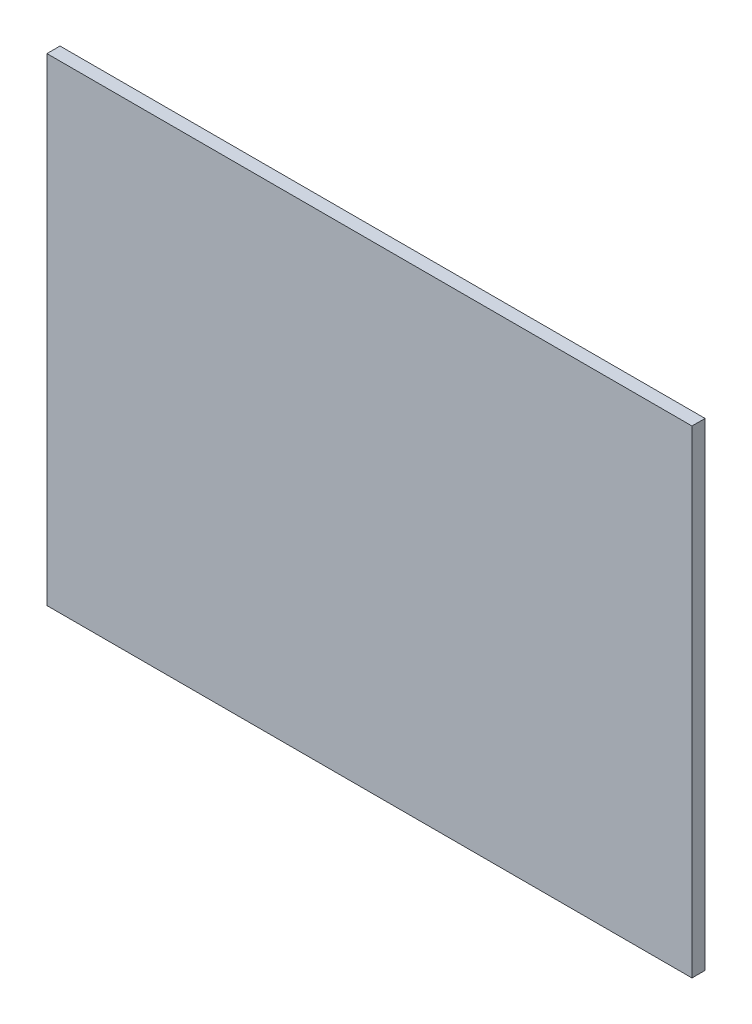
ISO-10303-21;
HEADER;
FILE_DESCRIPTION(('STEP AP214'),'2;1');
FILE_NAME('part.step','',(''),(''),'','','');
FILE_SCHEMA(('AUTOMOTIVE_DESIGN { 1 0 10303 214 1 1 1 1 }'));
ENDSEC;
DATA;
#1=APPLICATION_CONTEXT('core data for automotive mechanical design processes');
#2=APPLICATION_PROTOCOL_DEFINITION('international standard','automotive_design',2000,#1);
#3=PRODUCT_CONTEXT('',#1,'mechanical');
#4=PRODUCT('Part','Part','',(#3));
#5=PRODUCT_RELATED_PRODUCT_CATEGORY('part','',(#4));
#6=PRODUCT_DEFINITION_FORMATION('','',#4);
#7=PRODUCT_DEFINITION_CONTEXT('part definition',#1,'design');
#8=PRODUCT_DEFINITION('design','',#6,#7);
#9=PRODUCT_DEFINITION_SHAPE('','',#8);
#10=(LENGTH_UNIT() NAMED_UNIT(*) SI_UNIT(.MILLI.,.METRE.));
#11=(NAMED_UNIT(*) PLANE_ANGLE_UNIT() SI_UNIT($,.RADIAN.));
#12=(NAMED_UNIT(*) SI_UNIT($,.STERADIAN.) SOLID_ANGLE_UNIT());
#13=UNCERTAINTY_MEASURE_WITH_UNIT(LENGTH_MEASURE(1.E-05),#10,'distance_accuracy_value','');
#14=(GEOMETRIC_REPRESENTATION_CONTEXT(3) GLOBAL_UNCERTAINTY_ASSIGNED_CONTEXT((#13)) GLOBAL_UNIT_ASSIGNED_CONTEXT((#10,
#11,#12)) REPRESENTATION_CONTEXT('',''));
#15=CARTESIAN_POINT('',(0.,0.,0.));
#16=DIRECTION('',(0.,0.,1.));
#17=DIRECTION('',(1.,0.,0.));
#18=AXIS2_PLACEMENT_3D('',#15,#16,#17);
#19=CARTESIAN_POINT('',(49.25,36.5,2.));
#20=DIRECTION('',(-1.,0.,0.));
#21=DIRECTION('',(0.,-1.,0.));
#22=AXIS2_PLACEMENT_3D('',#19,#20,#21);
#23=PLANE('',#22);
#24=DIRECTION('',(0.,1.,0.));
#25=VECTOR('',#24,1.);
#26=CARTESIAN_POINT('',(49.25,36.5,0.));
#27=LINE('',#26,#25);
#28=CARTESIAN_POINT('',(49.25,-36.5,0.));
#29=VERTEX_POINT('',#28);
#30=CARTESIAN_POINT('',(49.25,36.5,0.));
#31=VERTEX_POINT('',#30);
#32=EDGE_CURVE('E96',#29,#31,#27,.T.);
#33=ORIENTED_EDGE('',*,*,#32,.T.);
#34=DIRECTION('',(0.,0.,-1.));
#35=VECTOR('',#34,1.);
#36=CARTESIAN_POINT('',(49.25,36.5,2.));
#37=LINE('',#36,#35);
#38=CARTESIAN_POINT('',(49.25,36.5,2.));
#39=VERTEX_POINT('',#38);
#40=EDGE_CURVE('E11',#39,#31,#37,.T.);
#41=ORIENTED_EDGE('',*,*,#40,.F.);
#42=DIRECTION('',(0.,1.,0.));
#43=VECTOR('',#42,1.);
#44=CARTESIAN_POINT('',(49.25,36.5,2.));
#45=LINE('',#44,#43);
#46=CARTESIAN_POINT('',(49.25,-36.5,2.));
#47=VERTEX_POINT('',#46);
#48=EDGE_CURVE('E84',#47,#39,#45,.T.);
#49=ORIENTED_EDGE('',*,*,#48,.F.);
#50=DIRECTION('',(0.,0.,-1.));
#51=VECTOR('',#50,1.);
#52=CARTESIAN_POINT('',(49.25,-36.5,2.));
#53=LINE('',#52,#51);
#54=EDGE_CURVE('E92',#47,#29,#53,.T.);
#55=ORIENTED_EDGE('',*,*,#54,.T.);
#56=EDGE_LOOP('',(#33,#41,#49,#55));
#57=FACE_BOUND('',#56,.T.);
#58=ADVANCED_FACE('F33',(#57),#23,.F.);
#59=CARTESIAN_POINT('',(-49.25,36.5,2.));
#60=DIRECTION('',(0.,-1.,0.));
#61=DIRECTION('',(0.,0.,-1.));
#62=AXIS2_PLACEMENT_3D('',#59,#60,#61);
#63=PLANE('',#62);
#64=DIRECTION('',(-1.,0.,0.));
#65=VECTOR('',#64,1.);
#66=CARTESIAN_POINT('',(-49.25,36.5,0.));
#67=LINE('',#66,#65);
#68=CARTESIAN_POINT('',(-49.25,36.5,0.));
#69=VERTEX_POINT('',#68);
#70=EDGE_CURVE('E88',#31,#69,#67,.T.);
#71=ORIENTED_EDGE('',*,*,#70,.T.);
#72=DIRECTION('',(0.,0.,-1.));
#73=VECTOR('',#72,1.);
#74=CARTESIAN_POINT('',(-49.25,36.5,2.));
#75=LINE('',#74,#73);
#76=CARTESIAN_POINT('',(-49.25,36.5,2.));
#77=VERTEX_POINT('',#76);
#78=EDGE_CURVE('E41',#77,#69,#75,.T.);
#79=ORIENTED_EDGE('',*,*,#78,.F.);
#80=DIRECTION('',(-1.,0.,0.));
#81=VECTOR('',#80,1.);
#82=CARTESIAN_POINT('',(-49.25,36.5,2.));
#83=LINE('',#82,#81);
#84=EDGE_CURVE('E79',#39,#77,#83,.T.);
#85=ORIENTED_EDGE('',*,*,#84,.F.);
#86=ORIENTED_EDGE('',*,*,#40,.T.);
#87=EDGE_LOOP('',(#71,#79,#85,#86));
#88=FACE_BOUND('',#87,.T.);
#89=ADVANCED_FACE('F87',(#88),#63,.F.);
#90=CARTESIAN_POINT('',(-49.25,36.5,2.));
#91=DIRECTION('',(1.,0.,0.));
#92=DIRECTION('',(0.,1.,0.));
#93=AXIS2_PLACEMENT_3D('',#90,#91,#92);
#94=PLANE('',#93);
#95=DIRECTION('',(0.,-1.,0.));
#96=VECTOR('',#95,1.);
#97=CARTESIAN_POINT('',(-49.25,36.5,0.));
#98=LINE('',#97,#96);
#99=CARTESIAN_POINT('',(-49.25,-36.5,0.));
#100=VERTEX_POINT('',#99);
#101=EDGE_CURVE('E66',#69,#100,#98,.T.);
#102=ORIENTED_EDGE('',*,*,#101,.T.);
#103=DIRECTION('',(0.,0.,-1.));
#104=VECTOR('',#103,1.);
#105=CARTESIAN_POINT('',(-49.25,-36.5,2.));
#106=LINE('',#105,#104);
#107=CARTESIAN_POINT('',(-49.25,-36.5,2.));
#108=VERTEX_POINT('',#107);
#109=EDGE_CURVE('E89',#108,#100,#106,.T.);
#110=ORIENTED_EDGE('',*,*,#109,.F.);
#111=DIRECTION('',(0.,-1.,0.));
#112=VECTOR('',#111,1.);
#113=CARTESIAN_POINT('',(-49.25,36.5,2.));
#114=LINE('',#113,#112);
#115=EDGE_CURVE('E82',#77,#108,#114,.T.);
#116=ORIENTED_EDGE('',*,*,#115,.F.);
#117=ORIENTED_EDGE('',*,*,#78,.T.);
#118=EDGE_LOOP('',(#102,#110,#116,#117));
#119=FACE_BOUND('',#118,.T.);
#120=ADVANCED_FACE('F90',(#119),#94,.F.);
#121=CARTESIAN_POINT('',(-49.25,-36.5,2.));
#122=DIRECTION('',(0.,1.,0.));
#123=DIRECTION('',(0.,0.,1.));
#124=AXIS2_PLACEMENT_3D('',#121,#122,#123);
#125=PLANE('',#124);
#126=DIRECTION('',(1.,0.,0.));
#127=VECTOR('',#126,1.);
#128=CARTESIAN_POINT('',(-49.25,-36.5,0.));
#129=LINE('',#128,#127);
#130=EDGE_CURVE('E72',#100,#29,#129,.T.);
#131=ORIENTED_EDGE('',*,*,#130,.T.);
#132=ORIENTED_EDGE('',*,*,#54,.F.);
#133=DIRECTION('',(1.,0.,0.));
#134=VECTOR('',#133,1.);
#135=CARTESIAN_POINT('',(-49.25,-36.5,2.));
#136=LINE('',#135,#134);
#137=EDGE_CURVE('E49',#108,#47,#136,.T.);
#138=ORIENTED_EDGE('',*,*,#137,.F.);
#139=ORIENTED_EDGE('',*,*,#109,.T.);
#140=EDGE_LOOP('',(#131,#132,#138,#139));
#141=FACE_BOUND('',#140,.T.);
#142=ADVANCED_FACE('F103',(#141),#125,.F.);
#143=CARTESIAN_POINT('',(0.,0.,2.));
#144=DIRECTION('',(0.,0.,1.));
#145=DIRECTION('',(1.,0.,0.));
#146=AXIS2_PLACEMENT_3D('',#143,#144,#145);
#147=PLANE('',#146);
#148=ORIENTED_EDGE('',*,*,#48,.T.);
#149=ORIENTED_EDGE('',*,*,#84,.T.);
#150=ORIENTED_EDGE('',*,*,#115,.T.);
#151=ORIENTED_EDGE('',*,*,#137,.T.);
#152=EDGE_LOOP('',(#148,#149,#150,#151));
#153=FACE_BOUND('',#152,.T.);
#154=ADVANCED_FACE('F80',(#153),#147,.T.);
#155=CARTESIAN_POINT('',(0.,0.,0.));
#156=DIRECTION('',(0.,0.,1.));
#157=DIRECTION('',(1.,0.,0.));
#158=AXIS2_PLACEMENT_3D('',#155,#156,#157);
#159=PLANE('',#158);
#160=ORIENTED_EDGE('',*,*,#32,.F.);
#161=ORIENTED_EDGE('',*,*,#130,.F.);
#162=ORIENTED_EDGE('',*,*,#101,.F.);
#163=ORIENTED_EDGE('',*,*,#70,.F.);
#164=EDGE_LOOP('',(#160,#161,#162,#163));
#165=FACE_BOUND('',#164,.T.);
#166=ADVANCED_FACE('F106',(#165),#159,.F.);
#167=CLOSED_SHELL('',(#58,#89,#120,#142,#154,#166));
#168=MANIFOLD_SOLID_BREP('B2',#167);
#169=ADVANCED_BREP_SHAPE_REPRESENTATION('',(#18,#168),#14);
#170=SHAPE_DEFINITION_REPRESENTATION(#9,#169);
ENDSEC;
END-ISO-10303-21;
